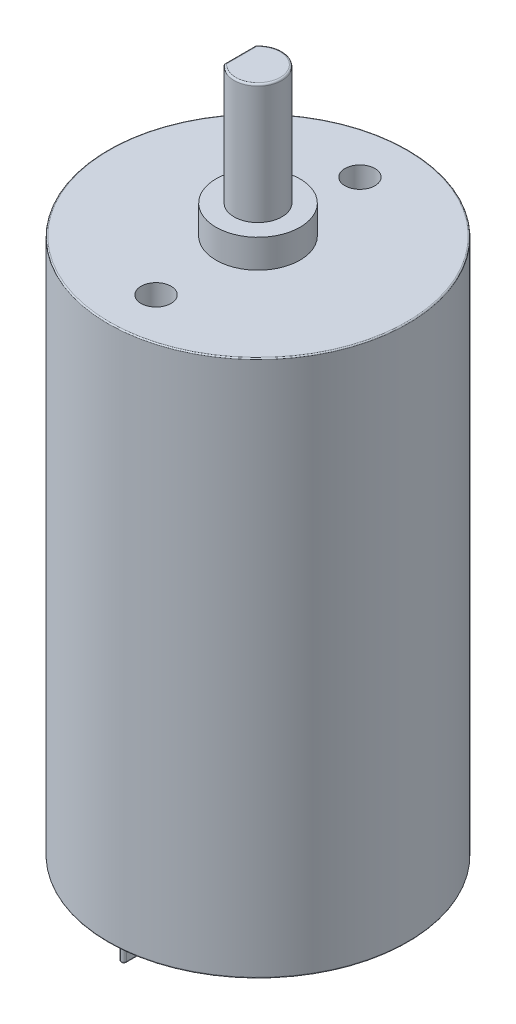
ISO-10303-21;
HEADER;
FILE_DESCRIPTION(('STEP AP214'),'2;1');
FILE_NAME('part.step','',(''),(''),'','','');
FILE_SCHEMA(('AUTOMOTIVE_DESIGN { 1 0 10303 214 1 1 1 1 }'));
ENDSEC;
DATA;
#1=APPLICATION_CONTEXT('core data for automotive mechanical design processes');
#2=APPLICATION_PROTOCOL_DEFINITION('international standard','automotive_design',2000,#1);
#3=PRODUCT_CONTEXT('',#1,'mechanical');
#4=PRODUCT('Part','Part','',(#3));
#5=PRODUCT_RELATED_PRODUCT_CATEGORY('part','',(#4));
#6=PRODUCT_DEFINITION_FORMATION('','',#4);
#7=PRODUCT_DEFINITION_CONTEXT('part definition',#1,'design');
#8=PRODUCT_DEFINITION('design','',#6,#7);
#9=PRODUCT_DEFINITION_SHAPE('','',#8);
#10=(LENGTH_UNIT() NAMED_UNIT(*) SI_UNIT(.MILLI.,.METRE.));
#11=(NAMED_UNIT(*) PLANE_ANGLE_UNIT() SI_UNIT($,.RADIAN.));
#12=(NAMED_UNIT(*) SI_UNIT($,.STERADIAN.) SOLID_ANGLE_UNIT());
#13=UNCERTAINTY_MEASURE_WITH_UNIT(LENGTH_MEASURE(1.E-05),#10,'distance_accuracy_value','');
#14=(GEOMETRIC_REPRESENTATION_CONTEXT(3) GLOBAL_UNCERTAINTY_ASSIGNED_CONTEXT((#13)) GLOBAL_UNIT_ASSIGNED_CONTEXT((#10,
#11,#12)) REPRESENTATION_CONTEXT('',''));
#15=CARTESIAN_POINT('',(0.,0.,0.));
#16=DIRECTION('',(0.,0.,1.));
#17=DIRECTION('',(1.,0.,0.));
#18=AXIS2_PLACEMENT_3D('',#15,#16,#17);
#19=CARTESIAN_POINT('',(0.,57.18,0.));
#20=DIRECTION('',(0.,1.,0.));
#21=DIRECTION('',(0.,0.,1.));
#22=AXIS2_PLACEMENT_3D('',#19,#20,#21);
#23=PLANE('',#22);
#24=CARTESIAN_POINT('',(0.,57.18,0.));
#25=DIRECTION('',(0.,1.,0.));
#26=DIRECTION('',(0.,0.,1.));
#27=AXIS2_PLACEMENT_3D('',#24,#25,#26);
#28=CIRCLE('',#27,1.85);
#29=CARTESIAN_POINT('',(-1.36050372088095,57.18,1.25360664702652));
#30=VERTEX_POINT('',#29);
#31=CARTESIAN_POINT('',(-1.36050372088095,57.18,-1.25360664702652));
#32=VERTEX_POINT('',#31);
#33=EDGE_CURVE('E316',#30,#32,#28,.T.);
#34=ORIENTED_EDGE('',*,*,#33,.T.);
#35=DIRECTION('',(0.,0.,1.));
#36=VECTOR('',#35,1.);
#37=CARTESIAN_POINT('',(-1.36050372088097,57.18,0.));
#38=LINE('',#37,#36);
#39=EDGE_CURVE('E323',#32,#30,#38,.T.);
#40=ORIENTED_EDGE('',*,*,#39,.T.);
#41=EDGE_LOOP('',(#34,#40));
#42=FACE_BOUND('',#41,.T.);
#43=ADVANCED_FACE('F44',(#42),#23,.T.);
#44=CARTESIAN_POINT('',(0.,0.,0.));
#45=DIRECTION('',(0.,1.,0.));
#46=DIRECTION('',(0.,0.,1.));
#47=AXIS2_PLACEMENT_3D('',#44,#45,#46);
#48=PLANE('',#47);
#49=CARTESIAN_POINT('',(0.,0.,0.));
#50=DIRECTION('',(0.,1.,0.));
#51=DIRECTION('',(0.,0.,1.));
#52=AXIS2_PLACEMENT_3D('',#49,#50,#51);
#53=CIRCLE('',#52,3.);
#54=CARTESIAN_POINT('',(0.,0.,3.));
#55=VERTEX_POINT('',#54);
#56=EDGE_CURVE('E292',#55,#55,#53,.F.);
#57=ORIENTED_EDGE('',*,*,#56,.F.);
#58=EDGE_LOOP('',(#57));
#59=FACE_BOUND('',#58,.T.);
#60=CARTESIAN_POINT('',(0.,0.,0.));
#61=DIRECTION('',(0.,1.,0.));
#62=DIRECTION('',(0.,0.,1.));
#63=AXIS2_PLACEMENT_3D('',#60,#61,#62);
#64=CIRCLE('',#63,12.4);
#65=CARTESIAN_POINT('',(0.,0.,12.4));
#66=VERTEX_POINT('',#65);
#67=EDGE_CURVE('E276',#66,#66,#64,.F.);
#68=ORIENTED_EDGE('',*,*,#67,.T.);
#69=EDGE_LOOP('',(#68));
#70=FACE_BOUND('',#69,.T.);
#71=CARTESIAN_POINT('',(-1.50048862059998,0.,9.68986048477996));
#72=DIRECTION('',(0.,-1.,0.));
#73=DIRECTION('',(0.,0.,-1.));
#74=AXIS2_PLACEMENT_3D('',#71,#72,#73);
#75=CIRCLE('',#74,0.21714186660976);
#76=CARTESIAN_POINT('',(-1.28334675399022,0.,9.68986048477996));
#77=VERTEX_POINT('',#76);
#78=CARTESIAN_POINT('',(-1.71763048720974,0.,9.68986048477996));
#79=VERTEX_POINT('',#78);
#80=EDGE_CURVE('E210',#77,#79,#75,.T.);
#81=ORIENTED_EDGE('',*,*,#80,.F.);
#82=DIRECTION('',(0.,0.,-1.));
#83=VECTOR('',#82,1.);
#84=CARTESIAN_POINT('',(-1.28334675399022,0.,9.68986048477996));
#85=LINE('',#84,#83);
#86=CARTESIAN_POINT('',(-1.28334675399022,0.,8.31013951522004));
#87=VERTEX_POINT('',#86);
#88=EDGE_CURVE('E234',#77,#87,#85,.T.);
#89=ORIENTED_EDGE('',*,*,#88,.T.);
#90=CARTESIAN_POINT('',(-1.50048862059998,0.,8.31013951522004));
#91=DIRECTION('',(0.,-1.,0.));
#92=DIRECTION('',(0.,0.,-1.));
#93=AXIS2_PLACEMENT_3D('',#90,#91,#92);
#94=CIRCLE('',#93,0.21714186660976);
#95=CARTESIAN_POINT('',(-1.71763048720974,0.,8.31013951522004));
#96=VERTEX_POINT('',#95);
#97=EDGE_CURVE('E240',#96,#87,#94,.T.);
#98=ORIENTED_EDGE('',*,*,#97,.F.);
#99=DIRECTION('',(0.,0.,-1.));
#100=VECTOR('',#99,1.);
#101=CARTESIAN_POINT('',(-1.71763048720974,0.,9.68986048477996));
#102=LINE('',#101,#100);
#103=EDGE_CURVE('E239',#79,#96,#102,.T.);
#104=ORIENTED_EDGE('',*,*,#103,.F.);
#105=EDGE_LOOP('',(#81,#89,#98,#104));
#106=FACE_BOUND('',#105,.T.);
#107=CARTESIAN_POINT('',(1.5,0.,-8.31013951522005));
#108=DIRECTION('',(0.,-1.,0.));
#109=DIRECTION('',(0.,0.,-1.));
#110=AXIS2_PLACEMENT_3D('',#107,#108,#109);
#111=CIRCLE('',#110,0.21714186660976);
#112=CARTESIAN_POINT('',(1.71714186660976,0.,-8.31013951522005));
#113=VERTEX_POINT('',#112);
#114=CARTESIAN_POINT('',(1.28285813339024,0.,-8.31013951522005));
#115=VERTEX_POINT('',#114);
#116=EDGE_CURVE('E205',#113,#115,#111,.T.);
#117=ORIENTED_EDGE('',*,*,#116,.F.);
#118=DIRECTION('',(0.,0.,-1.));
#119=VECTOR('',#118,1.);
#120=CARTESIAN_POINT('',(1.71714186660976,0.,-8.31013951522005));
#121=LINE('',#120,#119);
#122=CARTESIAN_POINT('',(1.71714186660976,0.,-9.68986048477996));
#123=VERTEX_POINT('',#122);
#124=EDGE_CURVE('E212',#113,#123,#121,.T.);
#125=ORIENTED_EDGE('',*,*,#124,.T.);
#126=CARTESIAN_POINT('',(1.5,0.,-9.68986048477996));
#127=DIRECTION('',(0.,-1.,0.));
#128=DIRECTION('',(0.,0.,-1.));
#129=AXIS2_PLACEMENT_3D('',#126,#127,#128);
#130=CIRCLE('',#129,0.21714186660976);
#131=CARTESIAN_POINT('',(1.28285813339024,0.,-9.68986048477996));
#132=VERTEX_POINT('',#131);
#133=EDGE_CURVE('E208',#132,#123,#130,.T.);
#134=ORIENTED_EDGE('',*,*,#133,.F.);
#135=DIRECTION('',(0.,0.,-1.));
#136=VECTOR('',#135,1.);
#137=CARTESIAN_POINT('',(1.28285813339024,0.,-8.31013951522005));
#138=LINE('',#137,#136);
#139=EDGE_CURVE('E207',#115,#132,#138,.T.);
#140=ORIENTED_EDGE('',*,*,#139,.F.);
#141=EDGE_LOOP('',(#117,#125,#134,#140));
#142=FACE_BOUND('',#141,.T.);
#143=ADVANCED_FACE('F388',(#59,#70,#106,#142),#48,.F.);
#144=CARTESIAN_POINT('',(0.,44.8,0.));
#145=DIRECTION('',(0.,-1.,0.));
#146=DIRECTION('',(0.,0.,-1.));
#147=AXIS2_PLACEMENT_3D('',#144,#145,#146);
#148=CYLINDRICAL_SURFACE('',#147,12.5);
#149=CARTESIAN_POINT('',(0.,0.100000000000003,0.));
#150=DIRECTION('',(0.,1.,0.));
#151=DIRECTION('',(0.,0.,1.));
#152=AXIS2_PLACEMENT_3D('',#149,#150,#151);
#153=CIRCLE('',#152,12.5);
#154=CARTESIAN_POINT('',(0.,0.100000000000003,12.5));
#155=VERTEX_POINT('',#154);
#156=EDGE_CURVE('E279',#155,#155,#153,.T.);
#157=ORIENTED_EDGE('',*,*,#156,.T.);
#158=EDGE_LOOP('',(#157));
#159=FACE_BOUND('',#158,.T.);
#160=CARTESIAN_POINT('',(0.,44.7,0.));
#161=DIRECTION('',(0.,1.,0.));
#162=DIRECTION('',(0.,0.,1.));
#163=AXIS2_PLACEMENT_3D('',#160,#161,#162);
#164=CIRCLE('',#163,12.5);
#165=CARTESIAN_POINT('',(0.,44.7,12.5));
#166=VERTEX_POINT('',#165);
#167=EDGE_CURVE('E274',#166,#166,#164,.F.);
#168=ORIENTED_EDGE('',*,*,#167,.T.);
#169=EDGE_LOOP('',(#168));
#170=FACE_BOUND('',#169,.T.);
#171=ADVANCED_FACE('F385',(#159,#170),#148,.T.);
#172=CARTESIAN_POINT('',(0.,44.8,0.));
#173=DIRECTION('',(0.,1.,0.));
#174=DIRECTION('',(0.,0.,1.));
#175=AXIS2_PLACEMENT_3D('',#172,#173,#174);
#176=PLANE('',#175);
#177=CARTESIAN_POINT('',(0.,44.8,0.));
#178=DIRECTION('',(0.,1.,0.));
#179=DIRECTION('',(0.,0.,1.));
#180=AXIS2_PLACEMENT_3D('',#177,#178,#179);
#181=CIRCLE('',#180,3.5);
#182=CARTESIAN_POINT('',(0.,44.8,3.5));
#183=VERTEX_POINT('',#182);
#184=EDGE_CURVE('E183',#183,#183,#181,.T.);
#185=ORIENTED_EDGE('',*,*,#184,.F.);
#186=EDGE_LOOP('',(#185));
#187=FACE_BOUND('',#186,.T.);
#188=CARTESIAN_POINT('',(0.,44.8,-8.5));
#189=DIRECTION('',(0.,1.,0.));
#190=DIRECTION('',(0.,0.,1.));
#191=AXIS2_PLACEMENT_3D('',#188,#189,#190);
#192=CIRCLE('',#191,1.25);
#193=CARTESIAN_POINT('',(0.,44.8,-7.25));
#194=VERTEX_POINT('',#193);
#195=EDGE_CURVE('E189',#194,#194,#192,.T.);
#196=ORIENTED_EDGE('',*,*,#195,.F.);
#197=EDGE_LOOP('',(#196));
#198=FACE_BOUND('',#197,.T.);
#199=CARTESIAN_POINT('',(0.,44.8,8.5));
#200=DIRECTION('',(0.,1.,0.));
#201=DIRECTION('',(0.,0.,1.));
#202=AXIS2_PLACEMENT_3D('',#199,#200,#201);
#203=CIRCLE('',#202,1.25);
#204=CARTESIAN_POINT('',(0.,44.8,9.75));
#205=VERTEX_POINT('',#204);
#206=EDGE_CURVE('E197',#205,#205,#203,.T.);
#207=ORIENTED_EDGE('',*,*,#206,.F.);
#208=EDGE_LOOP('',(#207));
#209=FACE_BOUND('',#208,.T.);
#210=CARTESIAN_POINT('',(0.,44.8,0.));
#211=DIRECTION('',(0.,1.,0.));
#212=DIRECTION('',(0.,0.,1.));
#213=AXIS2_PLACEMENT_3D('',#210,#211,#212);
#214=CIRCLE('',#213,12.4);
#215=CARTESIAN_POINT('',(0.,44.8,12.4));
#216=VERTEX_POINT('',#215);
#217=EDGE_CURVE('E285',#216,#216,#214,.T.);
#218=ORIENTED_EDGE('',*,*,#217,.T.);
#219=EDGE_LOOP('',(#218));
#220=FACE_BOUND('',#219,.T.);
#221=ADVANCED_FACE('F383',(#187,#198,#209,#220),#176,.T.);
#222=CARTESIAN_POINT('',(-1.50048862059998,-3.5,9.68986048477996));
#223=DIRECTION('',(0.,1.,0.));
#224=DIRECTION('',(0.,0.,1.));
#225=AXIS2_PLACEMENT_3D('',#222,#223,#224);
#226=CYLINDRICAL_SURFACE('',#225,0.21714186660976);
#227=DIRECTION('',(0.,1.,0.));
#228=VECTOR('',#227,1.);
#229=CARTESIAN_POINT('',(-1.71763048720974,-3.5,9.68986048477996));
#230=LINE('',#229,#228);
#231=CARTESIAN_POINT('',(-1.71763048720974,-3.4,9.68986048477996));
#232=VERTEX_POINT('',#231);
#233=EDGE_CURVE('E222',#232,#79,#230,.T.);
#234=ORIENTED_EDGE('',*,*,#233,.F.);
#235=CARTESIAN_POINT('',(-1.50048862059998,-3.4,9.68986048477996));
#236=DIRECTION('',(0.,-1.,0.));
#237=DIRECTION('',(0.,0.,-1.));
#238=AXIS2_PLACEMENT_3D('',#235,#236,#237);
#239=CIRCLE('',#238,0.21714186660976);
#240=CARTESIAN_POINT('',(-1.28334675399022,-3.4,9.68986048477996));
#241=VERTEX_POINT('',#240);
#242=EDGE_CURVE('E287',#232,#241,#239,.F.);
#243=ORIENTED_EDGE('',*,*,#242,.T.);
#244=DIRECTION('',(0.,1.,0.));
#245=VECTOR('',#244,1.);
#246=CARTESIAN_POINT('',(-1.28334675399022,-3.5,9.68986048477996));
#247=LINE('',#246,#245);
#248=EDGE_CURVE('E235',#241,#77,#247,.T.);
#249=ORIENTED_EDGE('',*,*,#248,.T.);
#250=ORIENTED_EDGE('',*,*,#80,.T.);
#251=EDGE_LOOP('',(#234,#243,#249,#250));
#252=FACE_BOUND('',#251,.T.);
#253=ADVANCED_FACE('F395',(#252),#226,.T.);
#254=CARTESIAN_POINT('',(-1.71763048720974,-3.5,9.68986048477996));
#255=DIRECTION('',(1.,0.,0.));
#256=DIRECTION('',(0.,0.,-1.));
#257=AXIS2_PLACEMENT_3D('',#254,#255,#256);
#258=PLANE('',#257);
#259=DIRECTION('',(0.,1.,0.));
#260=VECTOR('',#259,1.);
#261=CARTESIAN_POINT('',(-1.71763048720974,-3.5,8.31013951522004));
#262=LINE('',#261,#260);
#263=CARTESIAN_POINT('',(-1.71763048720974,-3.4,8.31013951522004));
#264=VERTEX_POINT('',#263);
#265=EDGE_CURVE('E227',#264,#96,#262,.T.);
#266=ORIENTED_EDGE('',*,*,#265,.F.);
#267=DIRECTION('',(0.,0.,-1.));
#268=VECTOR('',#267,1.);
#269=CARTESIAN_POINT('',(-1.71763048720974,-3.4,9.68986048477996));
#270=LINE('',#269,#268);
#271=EDGE_CURVE('E290',#264,#232,#270,.F.);
#272=ORIENTED_EDGE('',*,*,#271,.T.);
#273=ORIENTED_EDGE('',*,*,#233,.T.);
#274=ORIENTED_EDGE('',*,*,#103,.T.);
#275=EDGE_LOOP('',(#266,#272,#273,#274));
#276=FACE_BOUND('',#275,.T.);
#277=ADVANCED_FACE('F409',(#276),#258,.F.);
#278=CARTESIAN_POINT('',(-1.50048862059998,-3.5,8.31013951522004));
#279=DIRECTION('',(0.,1.,0.));
#280=DIRECTION('',(0.,0.,1.));
#281=AXIS2_PLACEMENT_3D('',#278,#279,#280);
#282=CYLINDRICAL_SURFACE('',#281,0.21714186660976);
#283=DIRECTION('',(0.,1.,0.));
#284=VECTOR('',#283,1.);
#285=CARTESIAN_POINT('',(-1.28334675399022,-3.5,8.31013951522004));
#286=LINE('',#285,#284);
#287=CARTESIAN_POINT('',(-1.28334675399022,-3.4,8.31013951522004));
#288=VERTEX_POINT('',#287);
#289=EDGE_CURVE('E229',#288,#87,#286,.T.);
#290=ORIENTED_EDGE('',*,*,#289,.F.);
#291=CARTESIAN_POINT('',(-1.50048862059998,-3.4,8.31013951522004));
#292=DIRECTION('',(0.,-1.,0.));
#293=DIRECTION('',(0.,0.,-1.));
#294=AXIS2_PLACEMENT_3D('',#291,#292,#293);
#295=CIRCLE('',#294,0.21714186660976);
#296=EDGE_CURVE('E275',#288,#264,#295,.F.);
#297=ORIENTED_EDGE('',*,*,#296,.T.);
#298=ORIENTED_EDGE('',*,*,#265,.T.);
#299=ORIENTED_EDGE('',*,*,#97,.T.);
#300=EDGE_LOOP('',(#290,#297,#298,#299));
#301=FACE_BOUND('',#300,.T.);
#302=ADVANCED_FACE('F401',(#301),#282,.T.);
#303=CARTESIAN_POINT('',(-1.28334675399022,-3.5,9.68986048477996));
#304=DIRECTION('',(1.,0.,0.));
#305=DIRECTION('',(0.,0.,-1.));
#306=AXIS2_PLACEMENT_3D('',#303,#304,#305);
#307=PLANE('',#306);
#308=ORIENTED_EDGE('',*,*,#248,.F.);
#309=DIRECTION('',(0.,0.,-1.));
#310=VECTOR('',#309,1.);
#311=CARTESIAN_POINT('',(-1.28334675399022,-3.4,9.68986048477996));
#312=LINE('',#311,#310);
#313=EDGE_CURVE('E256',#241,#288,#312,.T.);
#314=ORIENTED_EDGE('',*,*,#313,.T.);
#315=ORIENTED_EDGE('',*,*,#289,.T.);
#316=ORIENTED_EDGE('',*,*,#88,.F.);
#317=EDGE_LOOP('',(#308,#314,#315,#316));
#318=FACE_BOUND('',#317,.T.);
#319=ADVANCED_FACE('F398',(#318),#307,.T.);
#320=CARTESIAN_POINT('',(-1.50048862059998,-3.5,9.68986048477996));
#321=DIRECTION('',(0.,-1.,0.));
#322=DIRECTION('',(0.,0.,-1.));
#323=AXIS2_PLACEMENT_3D('',#320,#321,#322);
#324=PLANE('',#323);
#325=CARTESIAN_POINT('',(-1.50048862059998,-3.5,8.31013951522004));
#326=DIRECTION('',(0.,-1.,0.));
#327=DIRECTION('',(0.,0.,-1.));
#328=AXIS2_PLACEMENT_3D('',#325,#326,#327);
#329=CIRCLE('',#328,0.11714186660976);
#330=CARTESIAN_POINT('',(-1.61763048720974,-3.5,8.31013951522004));
#331=VERTEX_POINT('',#330);
#332=CARTESIAN_POINT('',(-1.38334675399022,-3.5,8.31013951522004));
#333=VERTEX_POINT('',#332);
#334=EDGE_CURVE('E266',#331,#333,#329,.T.);
#335=ORIENTED_EDGE('',*,*,#334,.T.);
#336=DIRECTION('',(0.,0.,-1.));
#337=VECTOR('',#336,1.);
#338=CARTESIAN_POINT('',(-1.38334675399022,-3.5,9.68986048477996));
#339=LINE('',#338,#337);
#340=CARTESIAN_POINT('',(-1.38334675399022,-3.5,9.68986048477996));
#341=VERTEX_POINT('',#340);
#342=EDGE_CURVE('E268',#333,#341,#339,.F.);
#343=ORIENTED_EDGE('',*,*,#342,.T.);
#344=CARTESIAN_POINT('',(-1.50048862059998,-3.5,9.68986048477996));
#345=DIRECTION('',(0.,-1.,0.));
#346=DIRECTION('',(0.,0.,-1.));
#347=AXIS2_PLACEMENT_3D('',#344,#345,#346);
#348=CIRCLE('',#347,0.11714186660976);
#349=CARTESIAN_POINT('',(-1.61763048720974,-3.5,9.68986048477996));
#350=VERTEX_POINT('',#349);
#351=EDGE_CURVE('E265',#341,#350,#348,.T.);
#352=ORIENTED_EDGE('',*,*,#351,.T.);
#353=DIRECTION('',(0.,0.,-1.));
#354=VECTOR('',#353,1.);
#355=CARTESIAN_POINT('',(-1.61763048720974,-3.5,8.31013951522004));
#356=LINE('',#355,#354);
#357=EDGE_CURVE('E263',#350,#331,#356,.T.);
#358=ORIENTED_EDGE('',*,*,#357,.T.);
#359=EDGE_LOOP('',(#335,#343,#352,#358));
#360=FACE_BOUND('',#359,.T.);
#361=ADVANCED_FACE('F393',(#360),#324,.T.);
#362=CARTESIAN_POINT('',(1.5,-3.5,-8.31013951522005));
#363=DIRECTION('',(0.,1.,0.));
#364=DIRECTION('',(0.,0.,1.));
#365=AXIS2_PLACEMENT_3D('',#362,#363,#364);
#366=CYLINDRICAL_SURFACE('',#365,0.21714186660976);
#367=DIRECTION('',(0.,1.,0.));
#368=VECTOR('',#367,1.);
#369=CARTESIAN_POINT('',(1.28285813339024,-3.5,-8.31013951522005));
#370=LINE('',#369,#368);
#371=CARTESIAN_POINT('',(1.28285813339024,-3.4,-8.31013951522005));
#372=VERTEX_POINT('',#371);
#373=EDGE_CURVE('E221',#372,#115,#370,.T.);
#374=ORIENTED_EDGE('',*,*,#373,.F.);
#375=CARTESIAN_POINT('',(1.5,-3.4,-8.31013951522005));
#376=DIRECTION('',(0.,-1.,0.));
#377=DIRECTION('',(0.,0.,-1.));
#378=AXIS2_PLACEMENT_3D('',#375,#376,#377);
#379=CIRCLE('',#378,0.21714186660976);
#380=CARTESIAN_POINT('',(1.71714186660976,-3.4,-8.31013951522005));
#381=VERTEX_POINT('',#380);
#382=EDGE_CURVE('E254',#372,#381,#379,.F.);
#383=ORIENTED_EDGE('',*,*,#382,.T.);
#384=DIRECTION('',(0.,1.,0.));
#385=VECTOR('',#384,1.);
#386=CARTESIAN_POINT('',(1.71714186660976,-3.5,-8.31013951522005));
#387=LINE('',#386,#385);
#388=EDGE_CURVE('E217',#381,#113,#387,.T.);
#389=ORIENTED_EDGE('',*,*,#388,.T.);
#390=ORIENTED_EDGE('',*,*,#116,.T.);
#391=EDGE_LOOP('',(#374,#383,#389,#390));
#392=FACE_BOUND('',#391,.T.);
#393=ADVANCED_FACE('F400',(#392),#366,.T.);
#394=CARTESIAN_POINT('',(1.28285813339024,-3.5,-8.31013951522005));
#395=DIRECTION('',(1.,0.,0.));
#396=DIRECTION('',(0.,0.,-1.));
#397=AXIS2_PLACEMENT_3D('',#394,#395,#396);
#398=PLANE('',#397);
#399=DIRECTION('',(0.,1.,0.));
#400=VECTOR('',#399,1.);
#401=CARTESIAN_POINT('',(1.28285813339024,-3.5,-9.68986048477996));
#402=LINE('',#401,#400);
#403=CARTESIAN_POINT('',(1.28285813339024,-3.4,-9.68986048477996));
#404=VERTEX_POINT('',#403);
#405=EDGE_CURVE('E218',#404,#132,#402,.T.);
#406=ORIENTED_EDGE('',*,*,#405,.F.);
#407=DIRECTION('',(0.,0.,-1.));
#408=VECTOR('',#407,1.);
#409=CARTESIAN_POINT('',(1.28285813339024,-3.4,-8.31013951522005));
#410=LINE('',#409,#408);
#411=EDGE_CURVE('E289',#404,#372,#410,.F.);
#412=ORIENTED_EDGE('',*,*,#411,.T.);
#413=ORIENTED_EDGE('',*,*,#373,.T.);
#414=ORIENTED_EDGE('',*,*,#139,.T.);
#415=EDGE_LOOP('',(#406,#412,#413,#414));
#416=FACE_BOUND('',#415,.T.);
#417=ADVANCED_FACE('F416',(#416),#398,.F.);
#418=CARTESIAN_POINT('',(1.5,-3.5,-9.68986048477996));
#419=DIRECTION('',(0.,1.,0.));
#420=DIRECTION('',(0.,0.,1.));
#421=AXIS2_PLACEMENT_3D('',#418,#419,#420);
#422=CYLINDRICAL_SURFACE('',#421,0.21714186660976);
#423=DIRECTION('',(0.,1.,0.));
#424=VECTOR('',#423,1.);
#425=CARTESIAN_POINT('',(1.71714186660976,-3.5,-9.68986048477996));
#426=LINE('',#425,#424);
#427=CARTESIAN_POINT('',(1.71714186660976,-3.4,-9.68986048477996));
#428=VERTEX_POINT('',#427);
#429=EDGE_CURVE('E220',#428,#123,#426,.T.);
#430=ORIENTED_EDGE('',*,*,#429,.F.);
#431=CARTESIAN_POINT('',(1.5,-3.4,-9.68986048477996));
#432=DIRECTION('',(0.,-1.,0.));
#433=DIRECTION('',(0.,0.,-1.));
#434=AXIS2_PLACEMENT_3D('',#431,#432,#433);
#435=CIRCLE('',#434,0.21714186660976);
#436=EDGE_CURVE('E257',#428,#404,#435,.F.);
#437=ORIENTED_EDGE('',*,*,#436,.T.);
#438=ORIENTED_EDGE('',*,*,#405,.T.);
#439=ORIENTED_EDGE('',*,*,#133,.T.);
#440=EDGE_LOOP('',(#430,#437,#438,#439));
#441=FACE_BOUND('',#440,.T.);
#442=ADVANCED_FACE('F423',(#441),#422,.T.);
#443=CARTESIAN_POINT('',(1.71714186660976,-3.5,-8.31013951522005));
#444=DIRECTION('',(1.,0.,0.));
#445=DIRECTION('',(0.,0.,-1.));
#446=AXIS2_PLACEMENT_3D('',#443,#444,#445);
#447=PLANE('',#446);
#448=ORIENTED_EDGE('',*,*,#388,.F.);
#449=DIRECTION('',(0.,0.,-1.));
#450=VECTOR('',#449,1.);
#451=CARTESIAN_POINT('',(1.71714186660976,-3.4,-8.31013951522005));
#452=LINE('',#451,#450);
#453=EDGE_CURVE('E258',#381,#428,#452,.T.);
#454=ORIENTED_EDGE('',*,*,#453,.T.);
#455=ORIENTED_EDGE('',*,*,#429,.T.);
#456=ORIENTED_EDGE('',*,*,#124,.F.);
#457=EDGE_LOOP('',(#448,#454,#455,#456));
#458=FACE_BOUND('',#457,.T.);
#459=ADVANCED_FACE('F424',(#458),#447,.T.);
#460=CARTESIAN_POINT('',(1.5,-3.5,-8.31013951522005));
#461=DIRECTION('',(0.,-1.,0.));
#462=DIRECTION('',(0.,0.,-1.));
#463=AXIS2_PLACEMENT_3D('',#460,#461,#462);
#464=PLANE('',#463);
#465=DIRECTION('',(0.,0.,-1.));
#466=VECTOR('',#465,1.);
#467=CARTESIAN_POINT('',(1.61714186660976,-3.5,-8.31013951522005));
#468=LINE('',#467,#466);
#469=CARTESIAN_POINT('',(1.61714186660976,-3.5,-9.68986048477996));
#470=VERTEX_POINT('',#469);
#471=CARTESIAN_POINT('',(1.61714186660976,-3.5,-8.31013951522005));
#472=VERTEX_POINT('',#471);
#473=EDGE_CURVE('E247',#470,#472,#468,.F.);
#474=ORIENTED_EDGE('',*,*,#473,.T.);
#475=CARTESIAN_POINT('',(1.5,-3.5,-8.31013951522005));
#476=DIRECTION('',(0.,-1.,0.));
#477=DIRECTION('',(0.,0.,-1.));
#478=AXIS2_PLACEMENT_3D('',#475,#476,#477);
#479=CIRCLE('',#478,0.11714186660976);
#480=CARTESIAN_POINT('',(1.38285813339024,-3.5,-8.31013951522005));
#481=VERTEX_POINT('',#480);
#482=EDGE_CURVE('E249',#472,#481,#479,.T.);
#483=ORIENTED_EDGE('',*,*,#482,.T.);
#484=DIRECTION('',(0.,0.,-1.));
#485=VECTOR('',#484,1.);
#486=CARTESIAN_POINT('',(1.38285813339024,-3.5,-9.68986048477996));
#487=LINE('',#486,#485);
#488=CARTESIAN_POINT('',(1.38285813339024,-3.5,-9.68986048477996));
#489=VERTEX_POINT('',#488);
#490=EDGE_CURVE('E223',#481,#489,#487,.T.);
#491=ORIENTED_EDGE('',*,*,#490,.T.);
#492=CARTESIAN_POINT('',(1.5,-3.5,-9.68986048477996));
#493=DIRECTION('',(0.,-1.,0.));
#494=DIRECTION('',(0.,0.,-1.));
#495=AXIS2_PLACEMENT_3D('',#492,#493,#494);
#496=CIRCLE('',#495,0.11714186660976);
#497=EDGE_CURVE('E246',#489,#470,#496,.T.);
#498=ORIENTED_EDGE('',*,*,#497,.T.);
#499=EDGE_LOOP('',(#474,#483,#491,#498));
#500=FACE_BOUND('',#499,.T.);
#501=ADVANCED_FACE('F369',(#500),#464,.T.);
#502=CARTESIAN_POINT('',(1.5,-3.4,-9.68986048477996));
#503=DIRECTION('',(0.,-1.,0.));
#504=DIRECTION('',(0.,0.,-1.));
#505=AXIS2_PLACEMENT_3D('',#502,#503,#504);
#506=TOROIDAL_SURFACE('',#505,0.11714186660976,0.1);
#507=CARTESIAN_POINT('',(1.38285813339024,-3.4,-9.68986048477996));
#508=DIRECTION('',(0.,0.,1.));
#509=DIRECTION('',(1.,0.,0.));
#510=AXIS2_PLACEMENT_3D('',#507,#508,#509);
#511=CIRCLE('',#510,0.1);
#512=EDGE_CURVE('E296',#404,#489,#511,.T.);
#513=ORIENTED_EDGE('',*,*,#512,.F.);
#514=ORIENTED_EDGE('',*,*,#436,.F.);
#515=CARTESIAN_POINT('',(1.61714186660976,-3.4,-9.68986048477996));
#516=DIRECTION('',(0.,0.,1.));
#517=DIRECTION('',(1.,0.,0.));
#518=AXIS2_PLACEMENT_3D('',#515,#516,#517);
#519=CIRCLE('',#518,0.1);
#520=EDGE_CURVE('E226',#470,#428,#519,.T.);
#521=ORIENTED_EDGE('',*,*,#520,.F.);
#522=ORIENTED_EDGE('',*,*,#497,.F.);
#523=EDGE_LOOP('',(#513,#514,#521,#522));
#524=FACE_BOUND('',#523,.T.);
#525=ADVANCED_FACE('F366',(#524),#506,.T.);
#526=CARTESIAN_POINT('',(1.61714186660976,-3.4,-8.31013951522005));
#527=DIRECTION('',(0.,0.,-1.));
#528=DIRECTION('',(-1.,0.,0.));
#529=AXIS2_PLACEMENT_3D('',#526,#527,#528);
#530=CYLINDRICAL_SURFACE('',#529,0.1);
#531=ORIENTED_EDGE('',*,*,#520,.T.);
#532=ORIENTED_EDGE('',*,*,#453,.F.);
#533=CARTESIAN_POINT('',(1.61714186660976,-3.4,-8.31013951522005));
#534=DIRECTION('',(0.,0.,1.));
#535=DIRECTION('',(1.,0.,0.));
#536=AXIS2_PLACEMENT_3D('',#533,#534,#535);
#537=CIRCLE('',#536,0.1);
#538=EDGE_CURVE('E294',#472,#381,#537,.T.);
#539=ORIENTED_EDGE('',*,*,#538,.F.);
#540=ORIENTED_EDGE('',*,*,#473,.F.);
#541=EDGE_LOOP('',(#531,#532,#539,#540));
#542=FACE_BOUND('',#541,.T.);
#543=ADVANCED_FACE('F367',(#542),#530,.T.);
#544=CARTESIAN_POINT('',(1.38285813339024,-3.4,-8.31013951522005));
#545=DIRECTION('',(0.,0.,1.));
#546=DIRECTION('',(1.,0.,0.));
#547=AXIS2_PLACEMENT_3D('',#544,#545,#546);
#548=CYLINDRICAL_SURFACE('',#547,0.1);
#549=ORIENTED_EDGE('',*,*,#512,.T.);
#550=ORIENTED_EDGE('',*,*,#490,.F.);
#551=CARTESIAN_POINT('',(1.38285813339024,-3.4,-8.31013951522005));
#552=DIRECTION('',(0.,0.,1.));
#553=DIRECTION('',(1.,0.,0.));
#554=AXIS2_PLACEMENT_3D('',#551,#552,#553);
#555=CIRCLE('',#554,0.1);
#556=EDGE_CURVE('E291',#372,#481,#555,.T.);
#557=ORIENTED_EDGE('',*,*,#556,.F.);
#558=ORIENTED_EDGE('',*,*,#411,.F.);
#559=EDGE_LOOP('',(#549,#550,#557,#558));
#560=FACE_BOUND('',#559,.T.);
#561=ADVANCED_FACE('F372',(#560),#548,.T.);
#562=CARTESIAN_POINT('',(1.5,-3.4,-8.31013951522005));
#563=DIRECTION('',(0.,-1.,0.));
#564=DIRECTION('',(0.,0.,-1.));
#565=AXIS2_PLACEMENT_3D('',#562,#563,#564);
#566=TOROIDAL_SURFACE('',#565,0.11714186660976,0.1);
#567=ORIENTED_EDGE('',*,*,#538,.T.);
#568=ORIENTED_EDGE('',*,*,#382,.F.);
#569=ORIENTED_EDGE('',*,*,#556,.T.);
#570=ORIENTED_EDGE('',*,*,#482,.F.);
#571=EDGE_LOOP('',(#567,#568,#569,#570));
#572=FACE_BOUND('',#571,.T.);
#573=ADVANCED_FACE('F353',(#572),#566,.T.);
#574=CARTESIAN_POINT('',(-1.61763048720974,-3.4,9.68986048477996));
#575=DIRECTION('',(0.,0.,1.));
#576=DIRECTION('',(1.,0.,0.));
#577=AXIS2_PLACEMENT_3D('',#574,#575,#576);
#578=CYLINDRICAL_SURFACE('',#577,0.1);
#579=CARTESIAN_POINT('',(-1.61763048720974,-3.4,8.31013951522004));
#580=DIRECTION('',(0.,0.,-1.));
#581=DIRECTION('',(-1.,0.,0.));
#582=AXIS2_PLACEMENT_3D('',#579,#580,#581);
#583=CIRCLE('',#582,0.1);
#584=EDGE_CURVE('E306',#331,#264,#583,.T.);
#585=ORIENTED_EDGE('',*,*,#584,.F.);
#586=ORIENTED_EDGE('',*,*,#357,.F.);
#587=CARTESIAN_POINT('',(-1.61763048720974,-3.4,9.68986048477996));
#588=DIRECTION('',(0.,0.,1.));
#589=DIRECTION('',(1.,0.,0.));
#590=AXIS2_PLACEMENT_3D('',#587,#588,#589);
#591=CIRCLE('',#590,0.1);
#592=EDGE_CURVE('E298',#232,#350,#591,.T.);
#593=ORIENTED_EDGE('',*,*,#592,.F.);
#594=ORIENTED_EDGE('',*,*,#271,.F.);
#595=EDGE_LOOP('',(#585,#586,#593,#594));
#596=FACE_BOUND('',#595,.T.);
#597=ADVANCED_FACE('F348',(#596),#578,.T.);
#598=CARTESIAN_POINT('',(-1.50048862059998,-3.4,9.68986048477996));
#599=DIRECTION('',(0.,-1.,0.));
#600=DIRECTION('',(0.,0.,-1.));
#601=AXIS2_PLACEMENT_3D('',#598,#599,#600);
#602=TOROIDAL_SURFACE('',#601,0.11714186660976,0.1);
#603=ORIENTED_EDGE('',*,*,#592,.T.);
#604=ORIENTED_EDGE('',*,*,#351,.F.);
#605=CARTESIAN_POINT('',(-1.38334675399022,-3.4,9.68986048477996));
#606=DIRECTION('',(0.,0.,-1.));
#607=DIRECTION('',(-1.,0.,0.));
#608=AXIS2_PLACEMENT_3D('',#605,#606,#607);
#609=CIRCLE('',#608,0.1);
#610=EDGE_CURVE('E302',#241,#341,#609,.T.);
#611=ORIENTED_EDGE('',*,*,#610,.F.);
#612=ORIENTED_EDGE('',*,*,#242,.F.);
#613=EDGE_LOOP('',(#603,#604,#611,#612));
#614=FACE_BOUND('',#613,.T.);
#615=ADVANCED_FACE('F355',(#614),#602,.T.);
#616=CARTESIAN_POINT('',(-1.50048862059998,-3.4,8.31013951522004));
#617=DIRECTION('',(0.,-1.,0.));
#618=DIRECTION('',(0.,0.,-1.));
#619=AXIS2_PLACEMENT_3D('',#616,#617,#618);
#620=TOROIDAL_SURFACE('',#619,0.11714186660976,0.1);
#621=ORIENTED_EDGE('',*,*,#584,.T.);
#622=ORIENTED_EDGE('',*,*,#296,.F.);
#623=CARTESIAN_POINT('',(-1.38334675399022,-3.4,8.31013951522004));
#624=DIRECTION('',(0.,0.,1.));
#625=DIRECTION('',(1.,0.,0.));
#626=AXIS2_PLACEMENT_3D('',#623,#624,#625);
#627=CIRCLE('',#626,0.1);
#628=EDGE_CURVE('E201',#333,#288,#627,.T.);
#629=ORIENTED_EDGE('',*,*,#628,.F.);
#630=ORIENTED_EDGE('',*,*,#334,.F.);
#631=EDGE_LOOP('',(#621,#622,#629,#630));
#632=FACE_BOUND('',#631,.T.);
#633=ADVANCED_FACE('F356',(#632),#620,.T.);
#634=CARTESIAN_POINT('',(-1.38334675399022,-3.4,9.68986048477996));
#635=DIRECTION('',(0.,0.,-1.));
#636=DIRECTION('',(-1.,0.,0.));
#637=AXIS2_PLACEMENT_3D('',#634,#635,#636);
#638=CYLINDRICAL_SURFACE('',#637,0.1);
#639=ORIENTED_EDGE('',*,*,#610,.T.);
#640=ORIENTED_EDGE('',*,*,#342,.F.);
#641=ORIENTED_EDGE('',*,*,#628,.T.);
#642=ORIENTED_EDGE('',*,*,#313,.F.);
#643=EDGE_LOOP('',(#639,#640,#641,#642));
#644=FACE_BOUND('',#643,.T.);
#645=ADVANCED_FACE('F350',(#644),#638,.T.);
#646=CARTESIAN_POINT('',(0.,0.100000000000003,0.));
#647=DIRECTION('',(0.,1.,0.));
#648=DIRECTION('',(0.,0.,1.));
#649=AXIS2_PLACEMENT_3D('',#646,#647,#648);
#650=TOROIDAL_SURFACE('',#649,12.4,0.1);
#651=ORIENTED_EDGE('',*,*,#67,.F.);
#652=EDGE_LOOP('',(#651));
#653=FACE_BOUND('',#652,.T.);
#654=ORIENTED_EDGE('',*,*,#156,.F.);
#655=EDGE_LOOP('',(#654));
#656=FACE_BOUND('',#655,.T.);
#657=ADVANCED_FACE('F345',(#653,#656),#650,.T.);
#658=CARTESIAN_POINT('',(0.,44.7,0.));
#659=DIRECTION('',(0.,1.,0.));
#660=DIRECTION('',(0.,0.,1.));
#661=AXIS2_PLACEMENT_3D('',#658,#659,#660);
#662=TOROIDAL_SURFACE('',#661,12.4,0.1);
#663=ORIENTED_EDGE('',*,*,#167,.F.);
#664=EDGE_LOOP('',(#663));
#665=FACE_BOUND('',#664,.T.);
#666=ORIENTED_EDGE('',*,*,#217,.F.);
#667=EDGE_LOOP('',(#666));
#668=FACE_BOUND('',#667,.T.);
#669=ADVANCED_FACE('F338',(#665,#668),#662,.T.);
#670=CARTESIAN_POINT('',(0.,-2.6,0.));
#671=DIRECTION('',(0.,1.,0.));
#672=DIRECTION('',(0.,0.,1.));
#673=AXIS2_PLACEMENT_3D('',#670,#671,#672);
#674=CYLINDRICAL_SURFACE('',#673,3.);
#675=CARTESIAN_POINT('',(0.,-1.6,0.));
#676=DIRECTION('',(0.,-1.,0.));
#677=DIRECTION('',(0.,0.,-1.));
#678=AXIS2_PLACEMENT_3D('',#675,#676,#677);
#679=CIRCLE('',#678,3.);
#680=CARTESIAN_POINT('',(0.,-1.6,-3.));
#681=VERTEX_POINT('',#680);
#682=EDGE_CURVE('E317',#681,#681,#679,.F.);
#683=ORIENTED_EDGE('',*,*,#682,.T.);
#684=EDGE_LOOP('',(#683));
#685=FACE_BOUND('',#684,.T.);
#686=ORIENTED_EDGE('',*,*,#56,.T.);
#687=EDGE_LOOP('',(#686));
#688=FACE_BOUND('',#687,.T.);
#689=ADVANCED_FACE('F342',(#685,#688),#674,.T.);
#690=CARTESIAN_POINT('',(0.,-2.6,0.));
#691=DIRECTION('',(0.,-1.,0.));
#692=DIRECTION('',(0.,0.,-1.));
#693=AXIS2_PLACEMENT_3D('',#690,#691,#692);
#694=PLANE('',#693);
#695=CARTESIAN_POINT('',(0.,-2.6,0.));
#696=DIRECTION('',(0.,-1.,0.));
#697=DIRECTION('',(0.,0.,-1.));
#698=AXIS2_PLACEMENT_3D('',#695,#696,#697);
#699=CIRCLE('',#698,2.);
#700=CARTESIAN_POINT('',(0.,-2.6,-2.));
#701=VERTEX_POINT('',#700);
#702=EDGE_CURVE('E312',#701,#701,#699,.T.);
#703=ORIENTED_EDGE('',*,*,#702,.T.);
#704=EDGE_LOOP('',(#703));
#705=FACE_BOUND('',#704,.T.);
#706=ADVANCED_FACE('F336',(#705),#694,.T.);
#707=CARTESIAN_POINT('',(0.,-1.6,0.));
#708=DIRECTION('',(0.,-1.,0.));
#709=DIRECTION('',(0.,0.,-1.));
#710=AXIS2_PLACEMENT_3D('',#707,#708,#709);
#711=TOROIDAL_SURFACE('',#710,2.,1.);
#712=ORIENTED_EDGE('',*,*,#682,.F.);
#713=EDGE_LOOP('',(#712));
#714=FACE_BOUND('',#713,.T.);
#715=ORIENTED_EDGE('',*,*,#702,.F.);
#716=EDGE_LOOP('',(#715));
#717=FACE_BOUND('',#716,.T.);
#718=ADVANCED_FACE('F335',(#714,#717),#711,.T.);
#719=CARTESIAN_POINT('',(0.,41.3,8.5));
#720=DIRECTION('',(0.,1.,0.));
#721=DIRECTION('',(0.,0.,1.));
#722=AXIS2_PLACEMENT_3D('',#719,#720,#721);
#723=CONICAL_SURFACE('',#722,1.25,1.02974425867665);
#724=CARTESIAN_POINT('',(0.,40.5489242262155,8.5));
#725=VERTEX_POINT('',#724);
#726=VERTEX_LOOP('',#725);
#727=FACE_BOUND('',#726,.T.);
#728=CARTESIAN_POINT('',(0.,41.3,8.5));
#729=DIRECTION('',(0.,1.,0.));
#730=DIRECTION('',(0.,0.,1.));
#731=AXIS2_PLACEMENT_3D('',#728,#729,#730);
#732=CIRCLE('',#731,1.25);
#733=CARTESIAN_POINT('',(0.,41.3,9.75));
#734=VERTEX_POINT('',#733);
#735=EDGE_CURVE('E196',#734,#734,#732,.T.);
#736=ORIENTED_EDGE('',*,*,#735,.T.);
#737=EDGE_LOOP('',(#736));
#738=FACE_BOUND('',#737,.T.);
#739=ADVANCED_FACE('F340',(#727,#738),#723,.F.);
#740=CARTESIAN_POINT('',(0.,44.8,8.5));
#741=DIRECTION('',(0.,1.,0.));
#742=DIRECTION('',(0.,0.,1.));
#743=AXIS2_PLACEMENT_3D('',#740,#741,#742);
#744=CYLINDRICAL_SURFACE('',#743,1.25);
#745=ORIENTED_EDGE('',*,*,#735,.F.);
#746=EDGE_LOOP('',(#745));
#747=FACE_BOUND('',#746,.T.);
#748=ORIENTED_EDGE('',*,*,#206,.T.);
#749=EDGE_LOOP('',(#748));
#750=FACE_BOUND('',#749,.T.);
#751=ADVANCED_FACE('F441',(#747,#750),#744,.F.);
#752=CARTESIAN_POINT('',(0.,41.3,-8.5));
#753=DIRECTION('',(0.,1.,0.));
#754=DIRECTION('',(0.,0.,1.));
#755=AXIS2_PLACEMENT_3D('',#752,#753,#754);
#756=CONICAL_SURFACE('',#755,1.25,1.02974425867665);
#757=CARTESIAN_POINT('',(0.,40.5489242262155,-8.5));
#758=VERTEX_POINT('',#757);
#759=VERTEX_LOOP('',#758);
#760=FACE_BOUND('',#759,.T.);
#761=CARTESIAN_POINT('',(0.,41.3,-8.5));
#762=DIRECTION('',(0.,1.,0.));
#763=DIRECTION('',(0.,0.,1.));
#764=AXIS2_PLACEMENT_3D('',#761,#762,#763);
#765=CIRCLE('',#764,1.25);
#766=CARTESIAN_POINT('',(0.,41.3,-7.25));
#767=VERTEX_POINT('',#766);
#768=EDGE_CURVE('E192',#767,#767,#765,.T.);
#769=ORIENTED_EDGE('',*,*,#768,.T.);
#770=EDGE_LOOP('',(#769));
#771=FACE_BOUND('',#770,.T.);
#772=ADVANCED_FACE('F444',(#760,#771),#756,.F.);
#773=CARTESIAN_POINT('',(0.,44.8,-8.5));
#774=DIRECTION('',(0.,1.,0.));
#775=DIRECTION('',(0.,0.,1.));
#776=AXIS2_PLACEMENT_3D('',#773,#774,#775);
#777=CYLINDRICAL_SURFACE('',#776,1.25);
#778=ORIENTED_EDGE('',*,*,#768,.F.);
#779=EDGE_LOOP('',(#778));
#780=FACE_BOUND('',#779,.T.);
#781=ORIENTED_EDGE('',*,*,#195,.T.);
#782=EDGE_LOOP('',(#781));
#783=FACE_BOUND('',#782,.T.);
#784=ADVANCED_FACE('F446',(#780,#783),#777,.F.);
#785=CARTESIAN_POINT('',(0.,47.18,0.));
#786=DIRECTION('',(0.,1.,0.));
#787=DIRECTION('',(0.,0.,1.));
#788=AXIS2_PLACEMENT_3D('',#785,#786,#787);
#789=PLANE('',#788);
#790=CARTESIAN_POINT('',(0.,47.18,0.));
#791=DIRECTION('',(0.,1.,0.));
#792=DIRECTION('',(0.,0.,1.));
#793=AXIS2_PLACEMENT_3D('',#790,#791,#792);
#794=CIRCLE('',#793,3.5);
#795=CARTESIAN_POINT('',(0.,47.18,3.5));
#796=VERTEX_POINT('',#795);
#797=EDGE_CURVE('E184',#796,#796,#794,.T.);
#798=ORIENTED_EDGE('',*,*,#797,.T.);
#799=EDGE_LOOP('',(#798));
#800=FACE_BOUND('',#799,.T.);
#801=CARTESIAN_POINT('',(0.,47.18,0.));
#802=DIRECTION('',(0.,1.,0.));
#803=DIRECTION('',(0.,0.,1.));
#804=AXIS2_PLACEMENT_3D('',#801,#802,#803);
#805=CIRCLE('',#804,2.);
#806=CARTESIAN_POINT('',(0.,47.18,2.));
#807=VERTEX_POINT('',#806);
#808=EDGE_CURVE('E177',#807,#807,#805,.T.);
#809=ORIENTED_EDGE('',*,*,#808,.F.);
#810=EDGE_LOOP('',(#809));
#811=FACE_BOUND('',#810,.T.);
#812=ADVANCED_FACE('F452',(#800,#811),#789,.T.);
#813=CARTESIAN_POINT('',(0.,47.18,0.));
#814=DIRECTION('',(0.,-1.,0.));
#815=DIRECTION('',(0.,0.,-1.));
#816=AXIS2_PLACEMENT_3D('',#813,#814,#815);
#817=CYLINDRICAL_SURFACE('',#816,3.5);
#818=ORIENTED_EDGE('',*,*,#797,.F.);
#819=EDGE_LOOP('',(#818));
#820=FACE_BOUND('',#819,.T.);
#821=ORIENTED_EDGE('',*,*,#184,.T.);
#822=EDGE_LOOP('',(#821));
#823=FACE_BOUND('',#822,.T.);
#824=ADVANCED_FACE('F451',(#820,#823),#817,.T.);
#825=CARTESIAN_POINT('',(0.,57.18,0.));
#826=DIRECTION('',(0.,-1.,0.));
#827=DIRECTION('',(0.,0.,-1.));
#828=AXIS2_PLACEMENT_3D('',#825,#826,#827);
#829=CYLINDRICAL_SURFACE('',#828,2.);
#830=DIRECTION('',(0.,1.,0.));
#831=VECTOR('',#830,1.);
#832=CARTESIAN_POINT('',(-1.51050372088097,49.18,-1.31086937152592));
#833=LINE('',#832,#831);
#834=CARTESIAN_POINT('',(-1.51050372088097,49.18,-1.31086937152592));
#835=VERTEX_POINT('',#834);
#836=CARTESIAN_POINT('',(-1.51050372088097,57.03,-1.31086937152592));
#837=VERTEX_POINT('',#836);
#838=EDGE_CURVE('E169',#835,#837,#833,.T.);
#839=ORIENTED_EDGE('',*,*,#838,.T.);
#840=CARTESIAN_POINT('',(0.,57.03,0.));
#841=DIRECTION('',(0.,1.,0.));
#842=DIRECTION('',(0.,0.,1.));
#843=AXIS2_PLACEMENT_3D('',#840,#841,#842);
#844=CIRCLE('',#843,2.);
#845=CARTESIAN_POINT('',(-1.51050372088097,57.03,1.31086937152592));
#846=VERTEX_POINT('',#845);
#847=EDGE_CURVE('E11',#837,#846,#844,.F.);
#848=ORIENTED_EDGE('',*,*,#847,.T.);
#849=DIRECTION('',(0.,1.,0.));
#850=VECTOR('',#849,1.);
#851=CARTESIAN_POINT('',(-1.51050372088097,49.18,1.31086937152592));
#852=LINE('',#851,#850);
#853=CARTESIAN_POINT('',(-1.51050372088097,49.18,1.31086937152592));
#854=VERTEX_POINT('',#853);
#855=EDGE_CURVE('E166',#854,#846,#852,.T.);
#856=ORIENTED_EDGE('',*,*,#855,.F.);
#857=CARTESIAN_POINT('',(0.,49.18,0.));
#858=DIRECTION('',(0.,1.,0.));
#859=DIRECTION('',(0.,0.,1.));
#860=AXIS2_PLACEMENT_3D('',#857,#858,#859);
#861=CIRCLE('',#860,2.);
#862=EDGE_CURVE('E175',#835,#854,#861,.T.);
#863=ORIENTED_EDGE('',*,*,#862,.F.);
#864=EDGE_LOOP('',(#839,#848,#856,#863));
#865=FACE_BOUND('',#864,.T.);
#866=ORIENTED_EDGE('',*,*,#808,.T.);
#867=EDGE_LOOP('',(#866));
#868=FACE_BOUND('',#867,.T.);
#869=ADVANCED_FACE('F176',(#865,#868),#829,.T.);
#870=CARTESIAN_POINT('',(-1.51050372088097,49.18,-1.31086937152592));
#871=DIRECTION('',(-1.,0.,0.));
#872=DIRECTION('',(0.,0.,1.));
#873=AXIS2_PLACEMENT_3D('',#870,#871,#872);
#874=PLANE('',#873);
#875=ORIENTED_EDGE('',*,*,#855,.T.);
#876=DIRECTION('',(0.,0.,1.));
#877=VECTOR('',#876,1.);
#878=CARTESIAN_POINT('',(-1.51050372088097,57.03,-1.31086937152592));
#879=LINE('',#878,#877);
#880=EDGE_CURVE('E56',#846,#837,#879,.F.);
#881=ORIENTED_EDGE('',*,*,#880,.T.);
#882=ORIENTED_EDGE('',*,*,#838,.F.);
#883=DIRECTION('',(0.,0.,1.));
#884=VECTOR('',#883,1.);
#885=CARTESIAN_POINT('',(-1.51050372088097,49.18,-1.31086937152592));
#886=LINE('',#885,#884);
#887=EDGE_CURVE('E165',#835,#854,#886,.T.);
#888=ORIENTED_EDGE('',*,*,#887,.T.);
#889=EDGE_LOOP('',(#875,#881,#882,#888));
#890=FACE_BOUND('',#889,.T.);
#891=ADVANCED_FACE('F168',(#890),#874,.T.);
#892=CARTESIAN_POINT('',(0.,49.18,0.));
#893=DIRECTION('',(0.,1.,0.));
#894=DIRECTION('',(0.,0.,1.));
#895=AXIS2_PLACEMENT_3D('',#892,#893,#894);
#896=PLANE('',#895);
#897=ORIENTED_EDGE('',*,*,#862,.T.);
#898=ORIENTED_EDGE('',*,*,#887,.F.);
#899=EDGE_LOOP('',(#897,#898));
#900=FACE_BOUND('',#899,.T.);
#901=ADVANCED_FACE('F172',(#900),#896,.T.);
#902=CARTESIAN_POINT('',(0.,57.03,0.));
#903=DIRECTION('',(0.,1.,0.));
#904=DIRECTION('',(0.,0.,1.));
#905=AXIS2_PLACEMENT_3D('',#902,#903,#904);
#906=TOROIDAL_SURFACE('',#905,1.85,0.15);
#907=CARTESIAN_POINT('',(-1.51050372088097,57.03,1.31086937152592));
#908=CARTESIAN_POINT('',(-1.51051244810736,57.0380505955931,1.31087236873791));
#909=CARTESIAN_POINT('',(-1.50985619496925,57.0460960586193,1.31062757412292));
#910=CARTESIAN_POINT('',(-1.50728146831118,57.0619340962886,1.3096657432157));
#911=CARTESIAN_POINT('',(-1.50536606014993,57.0697272369777,1.30894985377922));
#912=CARTESIAN_POINT('',(-1.50034047917175,57.0848582999654,1.30706908682241));
#913=CARTESIAN_POINT('',(-1.49723045197868,57.0921962776218,1.30590426402692));
#914=CARTESIAN_POINT('',(-1.48993099098639,57.1062307704515,1.30316531633883));
#915=CARTESIAN_POINT('',(-1.48574128250679,57.1129271217938,1.30159108728875));
#916=CARTESIAN_POINT('',(-1.47630231690112,57.1256831012757,1.29803652305126));
#917=CARTESIAN_POINT('',(-1.47102867631199,57.1317220352331,1.29604682139029));
#918=CARTESIAN_POINT('',(-1.45965889797573,57.1428338830027,1.29174549650962));
#919=CARTESIAN_POINT('',(-1.45356247084556,57.1479064554143,1.2894337600175));
#920=CARTESIAN_POINT('',(-1.44033494096042,57.1572654883903,1.28440277530102));
#921=CARTESIAN_POINT('',(-1.43316368908966,57.1614864485725,1.28166739187741));
#922=CARTESIAN_POINT('',(-1.41829599836152,57.1686657522202,1.27597645692915));
#923=CARTESIAN_POINT('',(-1.41059951973494,57.1716239999521,1.27302088873095));
#924=CARTESIAN_POINT('',(-1.39630663951241,57.1758191530874,1.26751196922717));
#925=CARTESIAN_POINT('',(-1.38976260209461,57.1772704483518,1.26498238018856));
#926=CARTESIAN_POINT('',(-1.37657026853525,57.1792857956605,1.25986712365827));
#927=CARTESIAN_POINT('',(-1.36992217812653,57.1798514183751,1.25728156370412));
#928=CARTESIAN_POINT('',(-1.36235162836787,57.1799914811754,1.25432804547159));
#929=CARTESIAN_POINT('',(-1.36142757912726,57.1800000209354,1.2539673876153));
#930=CARTESIAN_POINT('',(-1.36050372088097,57.18,1.25360664702651));
#931=B_SPLINE_CURVE_WITH_KNOTS('',3,(#907,#908,#909,#910,#911,#912,#913,#914,#915,#916,#917,
#918,#919,#920,#921,#922,#923,#924,#925,#926,#927,#928,#929,#930),.UNSPECIFIED.,.F.,.F.,(4,2,2,
2,2,2,2,2,2,2,2,4),(0.,0.024113458329156,0.0481684298006166,0.0722204699054262,
0.0962786351115295,0.120952825581846,0.145635716961043,0.171800862969557,0.197967992357832,
0.219409229575819,0.240812399212317,0.243788152633441),.UNSPECIFIED.);
#932=EDGE_CURVE('E325',#846,#30,#931,.T.);
#933=ORIENTED_EDGE('',*,*,#932,.F.);
#934=ORIENTED_EDGE('',*,*,#847,.F.);
#935=CARTESIAN_POINT('',(-1.51050372088097,57.03,-1.31086937152592));
#936=CARTESIAN_POINT('',(-1.51051244810736,57.0380505955931,-1.31087236873791));
#937=CARTESIAN_POINT('',(-1.50985619496925,57.0460960586193,-1.31062757412292));
#938=CARTESIAN_POINT('',(-1.50728146831118,57.0619340962886,-1.3096657432157));
#939=CARTESIAN_POINT('',(-1.50536606014993,57.0697272369777,-1.30894985377922));
#940=CARTESIAN_POINT('',(-1.50034047917175,57.0848582999654,-1.30706908682241));
#941=CARTESIAN_POINT('',(-1.49723045197868,57.0921962776218,-1.30590426402692));
#942=CARTESIAN_POINT('',(-1.48993099098639,57.1062307704515,-1.30316531633883));
#943=CARTESIAN_POINT('',(-1.48574128250679,57.1129271217938,-1.30159108728875));
#944=CARTESIAN_POINT('',(-1.47630231690112,57.1256831012757,-1.29803652305126));
#945=CARTESIAN_POINT('',(-1.47102867631199,57.1317220352331,-1.29604682139029));
#946=CARTESIAN_POINT('',(-1.45965889797573,57.1428338830027,-1.29174549650962));
#947=CARTESIAN_POINT('',(-1.45356247084556,57.1479064554143,-1.2894337600175));
#948=CARTESIAN_POINT('',(-1.44033494096042,57.1572654883903,-1.28440277530102));
#949=CARTESIAN_POINT('',(-1.43316368908966,57.1614864485725,-1.28166739187741));
#950=CARTESIAN_POINT('',(-1.41829599836152,57.1686657522202,-1.27597645692915));
#951=CARTESIAN_POINT('',(-1.41059951973494,57.1716239999521,-1.27302088873095));
#952=CARTESIAN_POINT('',(-1.39630663951241,57.1758191530874,-1.26751196922717));
#953=CARTESIAN_POINT('',(-1.38976260209461,57.1772704483518,-1.26498238018856));
#954=CARTESIAN_POINT('',(-1.37657026853525,57.1792857956605,-1.25986712365827));
#955=CARTESIAN_POINT('',(-1.36992217812653,57.1798514183751,-1.25728156370412));
#956=CARTESIAN_POINT('',(-1.36235162836787,57.1799914811754,-1.25432804547159));
#957=CARTESIAN_POINT('',(-1.36142757912726,57.1800000209354,-1.2539673876153));
#958=CARTESIAN_POINT('',(-1.36050372088097,57.18,-1.25360664702651));
#959=B_SPLINE_CURVE_WITH_KNOTS('',3,(#935,#936,#937,#938,#939,#940,#941,#942,#943,#944,#945,
#946,#947,#948,#949,#950,#951,#952,#953,#954,#955,#956,#957,#958),.UNSPECIFIED.,.F.,.F.,(4,2,2,
2,2,2,2,2,2,2,2,4),(0.,0.024113458329156,0.0481684298006166,0.0722204699054262,
0.0962786351115295,0.120952825581846,0.145635716961043,0.171800862969557,0.197967992357832,
0.219409229575819,0.240812399212317,0.243788152633441),.UNSPECIFIED.);
#960=EDGE_CURVE('E49',#32,#837,#959,.F.);
#961=ORIENTED_EDGE('',*,*,#960,.F.);
#962=ORIENTED_EDGE('',*,*,#33,.F.);
#963=EDGE_LOOP('',(#933,#934,#961,#962));
#964=FACE_BOUND('',#963,.T.);
#965=ADVANCED_FACE('F50',(#964),#906,.T.);
#966=CARTESIAN_POINT('',(-1.36050372088097,57.03,0.));
#967=DIRECTION('',(0.,0.,1.));
#968=DIRECTION('',(1.,0.,0.));
#969=AXIS2_PLACEMENT_3D('',#966,#967,#968);
#970=CYLINDRICAL_SURFACE('',#969,0.15);
#971=ORIENTED_EDGE('',*,*,#960,.T.);
#972=ORIENTED_EDGE('',*,*,#880,.F.);
#973=ORIENTED_EDGE('',*,*,#932,.T.);
#974=ORIENTED_EDGE('',*,*,#39,.F.);
#975=EDGE_LOOP('',(#971,#972,#973,#974));
#976=FACE_BOUND('',#975,.T.);
#977=ADVANCED_FACE('F326',(#976),#970,.T.);
#978=CLOSED_SHELL('',(#43,#143,#171,#221,#253,#277,#302,#319,#361,#393,#417,#442,#459,#501,#525,
#543,#561,#573,#597,#615,#633,#645,#657,#669,#689,#706,#718,#739,#751,#772,#784,#812,#824,#869,
#891,#901,#965,#977));
#979=MANIFOLD_SOLID_BREP('B2',#978);
#980=ADVANCED_BREP_SHAPE_REPRESENTATION('',(#18,#979),#14);
#981=SHAPE_DEFINITION_REPRESENTATION(#9,#980);
ENDSEC;
END-ISO-10303-21;
